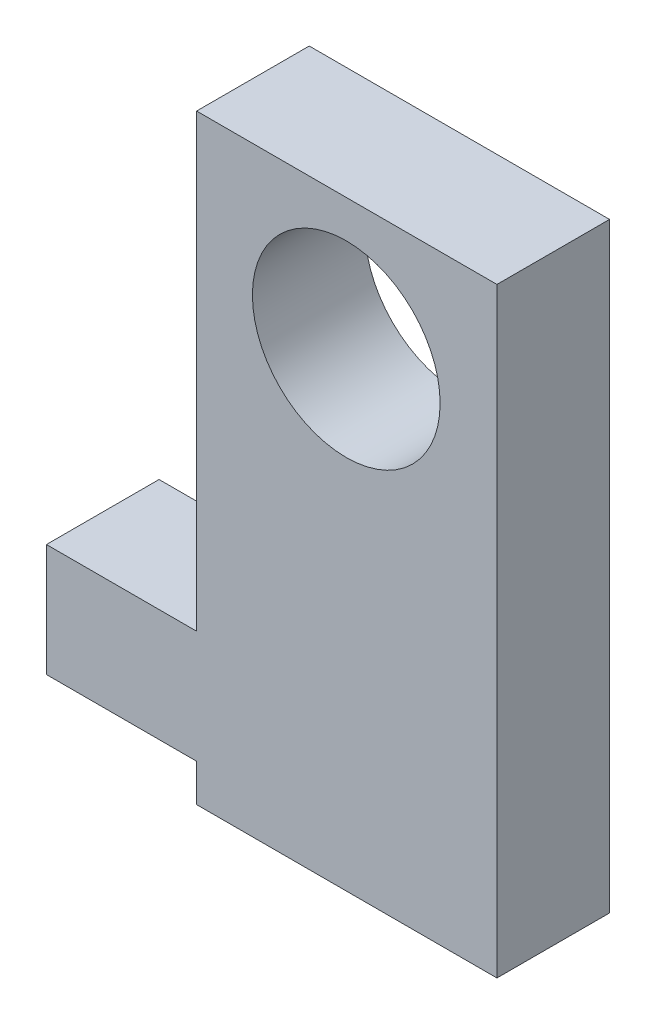
ISO-10303-21;
HEADER;
FILE_DESCRIPTION(('STEP AP214'),'2;1');
FILE_NAME('part.step','',(''),(''),'','','');
FILE_SCHEMA(('AUTOMOTIVE_DESIGN { 1 0 10303 214 1 1 1 1 }'));
ENDSEC;
DATA;
#1=APPLICATION_CONTEXT('core data for automotive mechanical design processes');
#2=APPLICATION_PROTOCOL_DEFINITION('international standard','automotive_design',2000,#1);
#3=PRODUCT_CONTEXT('',#1,'mechanical');
#4=PRODUCT('Part','Part','',(#3));
#5=PRODUCT_RELATED_PRODUCT_CATEGORY('part','',(#4));
#6=PRODUCT_DEFINITION_FORMATION('','',#4);
#7=PRODUCT_DEFINITION_CONTEXT('part definition',#1,'design');
#8=PRODUCT_DEFINITION('design','',#6,#7);
#9=PRODUCT_DEFINITION_SHAPE('','',#8);
#10=(LENGTH_UNIT() NAMED_UNIT(*) SI_UNIT(.MILLI.,.METRE.));
#11=(NAMED_UNIT(*) PLANE_ANGLE_UNIT() SI_UNIT($,.RADIAN.));
#12=(NAMED_UNIT(*) SI_UNIT($,.STERADIAN.) SOLID_ANGLE_UNIT());
#13=UNCERTAINTY_MEASURE_WITH_UNIT(LENGTH_MEASURE(1.E-05),#10,'distance_accuracy_value','');
#14=(GEOMETRIC_REPRESENTATION_CONTEXT(3) GLOBAL_UNCERTAINTY_ASSIGNED_CONTEXT((#13)) GLOBAL_UNIT_ASSIGNED_CONTEXT((#10,
#11,#12)) REPRESENTATION_CONTEXT('',''));
#15=CARTESIAN_POINT('',(0.,0.,0.));
#16=DIRECTION('',(0.,0.,1.));
#17=DIRECTION('',(1.,0.,0.));
#18=AXIS2_PLACEMENT_3D('',#15,#16,#17);
#19=CARTESIAN_POINT('',(0.,0.,3.));
#20=DIRECTION('',(1.,0.,0.));
#21=DIRECTION('',(0.,1.,0.));
#22=AXIS2_PLACEMENT_3D('',#19,#20,#21);
#23=PLANE('',#22);
#24=DIRECTION('',(0.,0.,-1.));
#25=VECTOR('',#24,1.);
#26=CARTESIAN_POINT('',(0.,4.,0.));
#27=LINE('',#26,#25);
#28=CARTESIAN_POINT('',(0.,4.,3.));
#29=VERTEX_POINT('',#28);
#30=CARTESIAN_POINT('',(0.,4.,0.));
#31=VERTEX_POINT('',#30);
#32=EDGE_CURVE('E58',#29,#31,#27,.T.);
#33=ORIENTED_EDGE('',*,*,#32,.F.);
#34=DIRECTION('',(0.,-1.,0.));
#35=VECTOR('',#34,1.);
#36=CARTESIAN_POINT('',(0.,0.,3.));
#37=LINE('',#36,#35);
#38=CARTESIAN_POINT('',(0.,16.,3.));
#39=VERTEX_POINT('',#38);
#40=EDGE_CURVE('E141',#39,#29,#37,.T.);
#41=ORIENTED_EDGE('',*,*,#40,.F.);
#42=DIRECTION('',(0.,0.,-1.));
#43=VECTOR('',#42,1.);
#44=CARTESIAN_POINT('',(0.,16.,3.));
#45=LINE('',#44,#43);
#46=CARTESIAN_POINT('',(0.,16.,0.));
#47=VERTEX_POINT('',#46);
#48=EDGE_CURVE('E150',#39,#47,#45,.T.);
#49=ORIENTED_EDGE('',*,*,#48,.T.);
#50=DIRECTION('',(0.,-1.,0.));
#51=VECTOR('',#50,1.);
#52=CARTESIAN_POINT('',(0.,0.,0.));
#53=LINE('',#52,#51);
#54=EDGE_CURVE('E151',#47,#31,#53,.T.);
#55=ORIENTED_EDGE('',*,*,#54,.T.);
#56=EDGE_LOOP('',(#33,#41,#49,#55));
#57=FACE_BOUND('',#56,.T.);
#58=ADVANCED_FACE('F43',(#57),#23,.F.);
#59=DIRECTION('',(0.,0.,1.));
#60=VECTOR('',#59,1.);
#61=CARTESIAN_POINT('',(0.,1.,0.));
#62=LINE('',#61,#60);
#63=CARTESIAN_POINT('',(0.,1.,0.));
#64=VERTEX_POINT('',#63);
#65=CARTESIAN_POINT('',(0.,1.,3.));
#66=VERTEX_POINT('',#65);
#67=EDGE_CURVE('E66',#64,#66,#62,.T.);
#68=ORIENTED_EDGE('',*,*,#67,.F.);
#69=CARTESIAN_POINT('',(0.,0.,0.));
#70=VERTEX_POINT('',#69);
#71=EDGE_CURVE('E132',#64,#70,#53,.T.);
#72=ORIENTED_EDGE('',*,*,#71,.T.);
#73=DIRECTION('',(0.,0.,-1.));
#74=VECTOR('',#73,1.);
#75=CARTESIAN_POINT('',(0.,0.,3.));
#76=LINE('',#75,#74);
#77=CARTESIAN_POINT('',(0.,0.,3.));
#78=VERTEX_POINT('',#77);
#79=EDGE_CURVE('E11',#78,#70,#76,.T.);
#80=ORIENTED_EDGE('',*,*,#79,.F.);
#81=EDGE_CURVE('E144',#66,#78,#37,.T.);
#82=ORIENTED_EDGE('',*,*,#81,.F.);
#83=EDGE_LOOP('',(#68,#72,#80,#82));
#84=FACE_BOUND('',#83,.T.);
#85=ADVANCED_FACE('F192',(#84),#23,.F.);
#86=CARTESIAN_POINT('',(0.,0.,3.));
#87=DIRECTION('',(0.,1.,0.));
#88=DIRECTION('',(0.,0.,1.));
#89=AXIS2_PLACEMENT_3D('',#86,#87,#88);
#90=PLANE('',#89);
#91=DIRECTION('',(1.,0.,0.));
#92=VECTOR('',#91,1.);
#93=CARTESIAN_POINT('',(0.,0.,0.));
#94=LINE('',#93,#92);
#95=CARTESIAN_POINT('',(8.,0.,0.));
#96=VERTEX_POINT('',#95);
#97=EDGE_CURVE('E153',#70,#96,#94,.T.);
#98=ORIENTED_EDGE('',*,*,#97,.T.);
#99=DIRECTION('',(0.,0.,-1.));
#100=VECTOR('',#99,1.);
#101=CARTESIAN_POINT('',(8.,0.,3.));
#102=LINE('',#101,#100);
#103=CARTESIAN_POINT('',(8.,0.,3.));
#104=VERTEX_POINT('',#103);
#105=EDGE_CURVE('E51',#104,#96,#102,.T.);
#106=ORIENTED_EDGE('',*,*,#105,.F.);
#107=DIRECTION('',(1.,0.,0.));
#108=VECTOR('',#107,1.);
#109=CARTESIAN_POINT('',(0.,0.,3.));
#110=LINE('',#109,#108);
#111=EDGE_CURVE('E143',#78,#104,#110,.T.);
#112=ORIENTED_EDGE('',*,*,#111,.F.);
#113=ORIENTED_EDGE('',*,*,#79,.T.);
#114=EDGE_LOOP('',(#98,#106,#112,#113));
#115=FACE_BOUND('',#114,.T.);
#116=ADVANCED_FACE('F191',(#115),#90,.F.);
#117=CARTESIAN_POINT('',(8.,0.,3.));
#118=DIRECTION('',(-1.,0.,0.));
#119=DIRECTION('',(0.,-1.,0.));
#120=AXIS2_PLACEMENT_3D('',#117,#118,#119);
#121=PLANE('',#120);
#122=DIRECTION('',(0.,1.,0.));
#123=VECTOR('',#122,1.);
#124=CARTESIAN_POINT('',(8.,0.,0.));
#125=LINE('',#124,#123);
#126=CARTESIAN_POINT('',(8.,16.,0.));
#127=VERTEX_POINT('',#126);
#128=EDGE_CURVE('E155',#96,#127,#125,.T.);
#129=ORIENTED_EDGE('',*,*,#128,.T.);
#130=DIRECTION('',(0.,0.,-1.));
#131=VECTOR('',#130,1.);
#132=CARTESIAN_POINT('',(8.,16.,3.));
#133=LINE('',#132,#131);
#134=CARTESIAN_POINT('',(8.,16.,3.));
#135=VERTEX_POINT('',#134);
#136=EDGE_CURVE('E161',#135,#127,#133,.T.);
#137=ORIENTED_EDGE('',*,*,#136,.F.);
#138=DIRECTION('',(0.,1.,0.));
#139=VECTOR('',#138,1.);
#140=CARTESIAN_POINT('',(8.,0.,3.));
#141=LINE('',#140,#139);
#142=EDGE_CURVE('E146',#104,#135,#141,.T.);
#143=ORIENTED_EDGE('',*,*,#142,.F.);
#144=ORIENTED_EDGE('',*,*,#105,.T.);
#145=EDGE_LOOP('',(#129,#137,#143,#144));
#146=FACE_BOUND('',#145,.T.);
#147=ADVANCED_FACE('F169',(#146),#121,.F.);
#148=CARTESIAN_POINT('',(0.,16.,3.));
#149=DIRECTION('',(0.,-1.,0.));
#150=DIRECTION('',(0.,0.,-1.));
#151=AXIS2_PLACEMENT_3D('',#148,#149,#150);
#152=PLANE('',#151);
#153=DIRECTION('',(-1.,0.,0.));
#154=VECTOR('',#153,1.);
#155=CARTESIAN_POINT('',(0.,16.,0.));
#156=LINE('',#155,#154);
#157=EDGE_CURVE('E157',#127,#47,#156,.T.);
#158=ORIENTED_EDGE('',*,*,#157,.T.);
#159=ORIENTED_EDGE('',*,*,#48,.F.);
#160=DIRECTION('',(-1.,0.,0.));
#161=VECTOR('',#160,1.);
#162=CARTESIAN_POINT('',(0.,16.,3.));
#163=LINE('',#162,#161);
#164=EDGE_CURVE('E148',#135,#39,#163,.T.);
#165=ORIENTED_EDGE('',*,*,#164,.F.);
#166=ORIENTED_EDGE('',*,*,#136,.T.);
#167=EDGE_LOOP('',(#158,#159,#165,#166));
#168=FACE_BOUND('',#167,.T.);
#169=ADVANCED_FACE('F176',(#168),#152,.F.);
#170=CARTESIAN_POINT('',(0.,0.,3.));
#171=DIRECTION('',(0.,0.,-1.));
#172=DIRECTION('',(-1.,0.,0.));
#173=AXIS2_PLACEMENT_3D('',#170,#171,#172);
#174=PLANE('',#173);
#175=CARTESIAN_POINT('',(3.98651130992279,12.5,3.));
#176=DIRECTION('',(0.,0.,1.));
#177=DIRECTION('',(1.,0.,0.));
#178=AXIS2_PLACEMENT_3D('',#175,#176,#177);
#179=CIRCLE('',#178,2.5);
#180=CARTESIAN_POINT('',(6.48651130992279,12.5,3.));
#181=VERTEX_POINT('',#180);
#182=EDGE_CURVE('E133',#181,#181,#179,.T.);
#183=ORIENTED_EDGE('',*,*,#182,.F.);
#184=EDGE_LOOP('',(#183));
#185=FACE_BOUND('',#184,.T.);
#186=ORIENTED_EDGE('',*,*,#40,.T.);
#187=DIRECTION('',(1.,0.,0.));
#188=VECTOR('',#187,1.);
#189=CARTESIAN_POINT('',(-4.,4.,3.));
#190=LINE('',#189,#188);
#191=CARTESIAN_POINT('',(-4.,4.,3.));
#192=VERTEX_POINT('',#191);
#193=EDGE_CURVE('E137',#192,#29,#190,.T.);
#194=ORIENTED_EDGE('',*,*,#193,.F.);
#195=DIRECTION('',(0.,1.,0.));
#196=VECTOR('',#195,1.);
#197=CARTESIAN_POINT('',(-4.,1.,3.));
#198=LINE('',#197,#196);
#199=CARTESIAN_POINT('',(-4.,1.,3.));
#200=VERTEX_POINT('',#199);
#201=EDGE_CURVE('E118',#200,#192,#198,.T.);
#202=ORIENTED_EDGE('',*,*,#201,.F.);
#203=DIRECTION('',(1.,0.,0.));
#204=VECTOR('',#203,1.);
#205=CARTESIAN_POINT('',(-4.,1.,3.));
#206=LINE('',#205,#204);
#207=EDGE_CURVE('E115',#200,#66,#206,.T.);
#208=ORIENTED_EDGE('',*,*,#207,.T.);
#209=ORIENTED_EDGE('',*,*,#81,.T.);
#210=ORIENTED_EDGE('',*,*,#111,.T.);
#211=ORIENTED_EDGE('',*,*,#142,.T.);
#212=ORIENTED_EDGE('',*,*,#164,.T.);
#213=EDGE_LOOP('',(#186,#194,#202,#208,#209,#210,#211,#212));
#214=FACE_BOUND('',#213,.T.);
#215=ADVANCED_FACE('F181',(#185,#214),#174,.F.);
#216=CARTESIAN_POINT('',(0.,0.,0.));
#217=DIRECTION('',(0.,0.,-1.));
#218=DIRECTION('',(-1.,0.,0.));
#219=AXIS2_PLACEMENT_3D('',#216,#217,#218);
#220=PLANE('',#219);
#221=CARTESIAN_POINT('',(3.98651130992279,12.5,0.));
#222=DIRECTION('',(0.,0.,-1.));
#223=DIRECTION('',(-1.,0.,0.));
#224=AXIS2_PLACEMENT_3D('',#221,#222,#223);
#225=CIRCLE('',#224,2.5);
#226=CARTESIAN_POINT('',(1.48651130992279,12.5,0.));
#227=VERTEX_POINT('',#226);
#228=EDGE_CURVE('E46',#227,#227,#225,.T.);
#229=ORIENTED_EDGE('',*,*,#228,.F.);
#230=EDGE_LOOP('',(#229));
#231=FACE_BOUND('',#230,.T.);
#232=ORIENTED_EDGE('',*,*,#54,.F.);
#233=ORIENTED_EDGE('',*,*,#157,.F.);
#234=ORIENTED_EDGE('',*,*,#128,.F.);
#235=ORIENTED_EDGE('',*,*,#97,.F.);
#236=ORIENTED_EDGE('',*,*,#71,.F.);
#237=DIRECTION('',(1.,0.,0.));
#238=VECTOR('',#237,1.);
#239=CARTESIAN_POINT('',(-4.,1.,0.));
#240=LINE('',#239,#238);
#241=CARTESIAN_POINT('',(-4.,1.,0.));
#242=VERTEX_POINT('',#241);
#243=EDGE_CURVE('E113',#242,#64,#240,.T.);
#244=ORIENTED_EDGE('',*,*,#243,.F.);
#245=DIRECTION('',(0.,-1.,0.));
#246=VECTOR('',#245,1.);
#247=CARTESIAN_POINT('',(-4.,1.,0.));
#248=LINE('',#247,#246);
#249=CARTESIAN_POINT('',(-4.,4.,0.));
#250=VERTEX_POINT('',#249);
#251=EDGE_CURVE('E119',#250,#242,#248,.T.);
#252=ORIENTED_EDGE('',*,*,#251,.F.);
#253=DIRECTION('',(1.,0.,0.));
#254=VECTOR('',#253,1.);
#255=CARTESIAN_POINT('',(-4.,4.,0.));
#256=LINE('',#255,#254);
#257=EDGE_CURVE('E184',#250,#31,#256,.T.);
#258=ORIENTED_EDGE('',*,*,#257,.T.);
#259=EDGE_LOOP('',(#232,#233,#234,#235,#236,#244,#252,#258));
#260=FACE_BOUND('',#259,.T.);
#261=ADVANCED_FACE('F130',(#231,#260),#220,.T.);
#262=CARTESIAN_POINT('',(3.98651130992279,12.5,-7.));
#263=DIRECTION('',(0.,0.,1.));
#264=DIRECTION('',(1.,0.,0.));
#265=AXIS2_PLACEMENT_3D('',#262,#263,#264);
#266=CYLINDRICAL_SURFACE('',#265,2.5);
#267=ORIENTED_EDGE('',*,*,#228,.T.);
#268=EDGE_LOOP('',(#267));
#269=FACE_BOUND('',#268,.T.);
#270=ORIENTED_EDGE('',*,*,#182,.T.);
#271=EDGE_LOOP('',(#270));
#272=FACE_BOUND('',#271,.T.);
#273=ADVANCED_FACE('F196',(#269,#272),#266,.F.);
#274=CARTESIAN_POINT('',(-4.,1.,0.));
#275=DIRECTION('',(0.,1.,0.));
#276=DIRECTION('',(0.,0.,1.));
#277=AXIS2_PLACEMENT_3D('',#274,#275,#276);
#278=PLANE('',#277);
#279=ORIENTED_EDGE('',*,*,#67,.T.);
#280=ORIENTED_EDGE('',*,*,#207,.F.);
#281=DIRECTION('',(0.,0.,1.));
#282=VECTOR('',#281,1.);
#283=CARTESIAN_POINT('',(-4.,1.,0.));
#284=LINE('',#283,#282);
#285=EDGE_CURVE('E109',#242,#200,#284,.T.);
#286=ORIENTED_EDGE('',*,*,#285,.F.);
#287=ORIENTED_EDGE('',*,*,#243,.T.);
#288=EDGE_LOOP('',(#279,#280,#286,#287));
#289=FACE_BOUND('',#288,.T.);
#290=ADVANCED_FACE('F111',(#289),#278,.F.);
#291=CARTESIAN_POINT('',(-4.,4.,0.));
#292=DIRECTION('',(0.,-1.,0.));
#293=DIRECTION('',(0.,0.,-1.));
#294=AXIS2_PLACEMENT_3D('',#291,#292,#293);
#295=PLANE('',#294);
#296=ORIENTED_EDGE('',*,*,#32,.T.);
#297=ORIENTED_EDGE('',*,*,#257,.F.);
#298=DIRECTION('',(0.,0.,-1.));
#299=VECTOR('',#298,1.);
#300=CARTESIAN_POINT('',(-4.,4.,0.));
#301=LINE('',#300,#299);
#302=EDGE_CURVE('E124',#192,#250,#301,.T.);
#303=ORIENTED_EDGE('',*,*,#302,.F.);
#304=ORIENTED_EDGE('',*,*,#193,.T.);
#305=EDGE_LOOP('',(#296,#297,#303,#304));
#306=FACE_BOUND('',#305,.T.);
#307=ADVANCED_FACE('F183',(#306),#295,.F.);
#308=CARTESIAN_POINT('',(-4.,0.,0.));
#309=DIRECTION('',(1.,0.,0.));
#310=DIRECTION('',(0.,0.,-1.));
#311=AXIS2_PLACEMENT_3D('',#308,#309,#310);
#312=PLANE('',#311);
#313=ORIENTED_EDGE('',*,*,#251,.T.);
#314=ORIENTED_EDGE('',*,*,#285,.T.);
#315=ORIENTED_EDGE('',*,*,#201,.T.);
#316=ORIENTED_EDGE('',*,*,#302,.T.);
#317=EDGE_LOOP('',(#313,#314,#315,#316));
#318=FACE_BOUND('',#317,.T.);
#319=ADVANCED_FACE('F122',(#318),#312,.F.);
#320=CLOSED_SHELL('',(#58,#85,#116,#147,#169,#215,#261,#273,#290,#307,#319));
#321=MANIFOLD_SOLID_BREP('B2',#320);
#322=ADVANCED_BREP_SHAPE_REPRESENTATION('',(#18,#321),#14);
#323=SHAPE_DEFINITION_REPRESENTATION(#9,#322);
ENDSEC;
END-ISO-10303-21;
